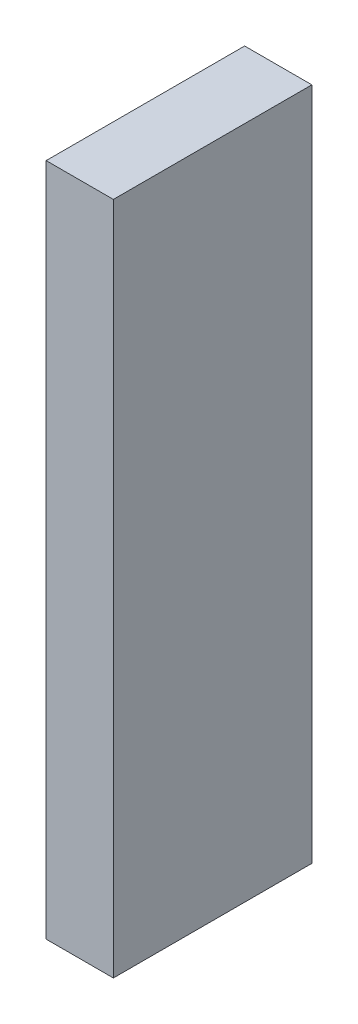
ISO-10303-21;
HEADER;
FILE_DESCRIPTION(('STEP AP214'),'2;1');
FILE_NAME('part.step','',(''),(''),'','','');
FILE_SCHEMA(('AUTOMOTIVE_DESIGN { 1 0 10303 214 1 1 1 1 }'));
ENDSEC;
DATA;
#1=APPLICATION_CONTEXT('core data for automotive mechanical design processes');
#2=APPLICATION_PROTOCOL_DEFINITION('international standard','automotive_design',2000,#1);
#3=PRODUCT_CONTEXT('',#1,'mechanical');
#4=PRODUCT('Part','Part','',(#3));
#5=PRODUCT_RELATED_PRODUCT_CATEGORY('part','',(#4));
#6=PRODUCT_DEFINITION_FORMATION('','',#4);
#7=PRODUCT_DEFINITION_CONTEXT('part definition',#1,'design');
#8=PRODUCT_DEFINITION('design','',#6,#7);
#9=PRODUCT_DEFINITION_SHAPE('','',#8);
#10=(LENGTH_UNIT() NAMED_UNIT(*) SI_UNIT(.MILLI.,.METRE.));
#11=(NAMED_UNIT(*) PLANE_ANGLE_UNIT() SI_UNIT($,.RADIAN.));
#12=(NAMED_UNIT(*) SI_UNIT($,.STERADIAN.) SOLID_ANGLE_UNIT());
#13=UNCERTAINTY_MEASURE_WITH_UNIT(LENGTH_MEASURE(1.E-05),#10,'distance_accuracy_value','');
#14=(GEOMETRIC_REPRESENTATION_CONTEXT(3) GLOBAL_UNCERTAINTY_ASSIGNED_CONTEXT((#13)) GLOBAL_UNIT_ASSIGNED_CONTEXT((#10,
#11,#12)) REPRESENTATION_CONTEXT('',''));
#15=CARTESIAN_POINT('',(0.,0.,0.));
#16=DIRECTION('',(0.,0.,1.));
#17=DIRECTION('',(1.,0.,0.));
#18=AXIS2_PLACEMENT_3D('',#15,#16,#17);
#19=CARTESIAN_POINT('',(-1.01597968,-10.1917754,0.));
#20=DIRECTION('',(-1.,0.,0.));
#21=DIRECTION('',(0.,0.,1.));
#22=AXIS2_PLACEMENT_3D('',#19,#20,#21);
#23=PLANE('',#22);
#24=DIRECTION('',(0.,0.,1.));
#25=VECTOR('',#24,1.);
#26=CARTESIAN_POINT('',(-1.01597968,10.19177794,0.));
#27=LINE('',#26,#25);
#28=CARTESIAN_POINT('',(-1.01597968,10.19177794,0.));
#29=VERTEX_POINT('',#28);
#30=CARTESIAN_POINT('',(-1.01597968,10.19177794,6.0000007));
#31=VERTEX_POINT('',#30);
#32=EDGE_CURVE('E20',#29,#31,#27,.T.);
#33=ORIENTED_EDGE('',*,*,#32,.F.);
#34=DIRECTION('',(0.,1.,0.));
#35=VECTOR('',#34,1.);
#36=CARTESIAN_POINT('',(-1.01597968,10.19177794,0.));
#37=LINE('',#36,#35);
#38=CARTESIAN_POINT('',(-1.01597968,-10.1917754,0.));
#39=VERTEX_POINT('',#38);
#40=EDGE_CURVE('E79',#29,#39,#37,.F.);
#41=ORIENTED_EDGE('',*,*,#40,.T.);
#42=DIRECTION('',(0.,0.,-1.));
#43=VECTOR('',#42,1.);
#44=CARTESIAN_POINT('',(-1.01597968,-10.1917754,0.));
#45=LINE('',#44,#43);
#46=CARTESIAN_POINT('',(-1.01597968,-10.1917754,6.0000007));
#47=VERTEX_POINT('',#46);
#48=EDGE_CURVE('E61',#47,#39,#45,.T.);
#49=ORIENTED_EDGE('',*,*,#48,.F.);
#50=DIRECTION('',(0.,1.,0.));
#51=VECTOR('',#50,1.);
#52=CARTESIAN_POINT('',(-1.01597968,10.19177794,6.0000007));
#53=LINE('',#52,#51);
#54=EDGE_CURVE('E56',#31,#47,#53,.F.);
#55=ORIENTED_EDGE('',*,*,#54,.F.);
#56=EDGE_LOOP('',(#33,#41,#49,#55));
#57=FACE_BOUND('',#56,.T.);
#58=ADVANCED_FACE('F17',(#57),#23,.T.);
#59=CARTESIAN_POINT('',(-1.01597968,10.19177794,0.));
#60=DIRECTION('',(0.,1.,0.));
#61=DIRECTION('',(0.,0.,1.));
#62=AXIS2_PLACEMENT_3D('',#59,#60,#61);
#63=PLANE('',#62);
#64=DIRECTION('',(0.,0.,-1.));
#65=VECTOR('',#64,1.);
#66=CARTESIAN_POINT('',(1.01597968,10.19177794,0.));
#67=LINE('',#66,#65);
#68=CARTESIAN_POINT('',(1.01597968,10.19177794,0.));
#69=VERTEX_POINT('',#68);
#70=CARTESIAN_POINT('',(1.01597968,10.19177794,6.0000007));
#71=VERTEX_POINT('',#70);
#72=EDGE_CURVE('E83',#69,#71,#67,.F.);
#73=ORIENTED_EDGE('',*,*,#72,.F.);
#74=DIRECTION('',(1.,0.,0.));
#75=VECTOR('',#74,1.);
#76=CARTESIAN_POINT('',(-1.01597968,10.19177794,0.));
#77=LINE('',#76,#75);
#78=EDGE_CURVE('E68',#69,#29,#77,.F.);
#79=ORIENTED_EDGE('',*,*,#78,.T.);
#80=ORIENTED_EDGE('',*,*,#32,.T.);
#81=DIRECTION('',(1.,0.,0.));
#82=VECTOR('',#81,1.);
#83=CARTESIAN_POINT('',(-1.01597968,10.19177794,6.0000007));
#84=LINE('',#83,#82);
#85=EDGE_CURVE('E63',#71,#31,#84,.F.);
#86=ORIENTED_EDGE('',*,*,#85,.F.);
#87=EDGE_LOOP('',(#73,#79,#80,#86));
#88=FACE_BOUND('',#87,.T.);
#89=ADVANCED_FACE('F65',(#88),#63,.T.);
#90=CARTESIAN_POINT('',(-1.01597968,10.19177794,6.0000007));
#91=DIRECTION('',(0.,0.,1.));
#92=DIRECTION('',(1.,0.,0.));
#93=AXIS2_PLACEMENT_3D('',#90,#91,#92);
#94=PLANE('',#93);
#95=DIRECTION('',(0.,1.,0.));
#96=VECTOR('',#95,1.);
#97=CARTESIAN_POINT('',(1.01597968,10.19177794,6.0000007));
#98=LINE('',#97,#96);
#99=CARTESIAN_POINT('',(1.01597968,-10.1917754,6.0000007));
#100=VERTEX_POINT('',#99);
#101=EDGE_CURVE('E72',#71,#100,#98,.F.);
#102=ORIENTED_EDGE('',*,*,#101,.F.);
#103=ORIENTED_EDGE('',*,*,#85,.T.);
#104=ORIENTED_EDGE('',*,*,#54,.T.);
#105=DIRECTION('',(1.,0.,0.));
#106=VECTOR('',#105,1.);
#107=CARTESIAN_POINT('',(1.01597968,-10.1917754,6.0000007));
#108=LINE('',#107,#106);
#109=EDGE_CURVE('E74',#100,#47,#108,.F.);
#110=ORIENTED_EDGE('',*,*,#109,.F.);
#111=EDGE_LOOP('',(#102,#103,#104,#110));
#112=FACE_BOUND('',#111,.T.);
#113=ADVANCED_FACE('F70',(#112),#94,.T.);
#114=CARTESIAN_POINT('',(1.01597968,-10.1917754,0.));
#115=DIRECTION('',(0.,-1.,0.));
#116=DIRECTION('',(0.,0.,-1.));
#117=AXIS2_PLACEMENT_3D('',#114,#115,#116);
#118=PLANE('',#117);
#119=ORIENTED_EDGE('',*,*,#48,.T.);
#120=DIRECTION('',(1.,0.,0.));
#121=VECTOR('',#120,1.);
#122=CARTESIAN_POINT('',(-1.01597968,-10.1917754,0.));
#123=LINE('',#122,#121);
#124=CARTESIAN_POINT('',(1.01597968,-10.1917754,0.));
#125=VERTEX_POINT('',#124);
#126=EDGE_CURVE('E35',#39,#125,#123,.T.);
#127=ORIENTED_EDGE('',*,*,#126,.T.);
#128=DIRECTION('',(0.,0.,-1.));
#129=VECTOR('',#128,1.);
#130=CARTESIAN_POINT('',(1.01597968,-10.1917754,0.));
#131=LINE('',#130,#129);
#132=EDGE_CURVE('E26',#100,#125,#131,.T.);
#133=ORIENTED_EDGE('',*,*,#132,.F.);
#134=ORIENTED_EDGE('',*,*,#109,.T.);
#135=EDGE_LOOP('',(#119,#127,#133,#134));
#136=FACE_BOUND('',#135,.T.);
#137=ADVANCED_FACE('F89',(#136),#118,.T.);
#138=CARTESIAN_POINT('',(-1.01597968,10.19177794,0.));
#139=DIRECTION('',(0.,0.,1.));
#140=DIRECTION('',(1.,0.,0.));
#141=AXIS2_PLACEMENT_3D('',#138,#139,#140);
#142=PLANE('',#141);
#143=DIRECTION('',(0.,1.,0.));
#144=VECTOR('',#143,1.);
#145=CARTESIAN_POINT('',(1.01597968,10.19177794,0.));
#146=LINE('',#145,#144);
#147=EDGE_CURVE('E11',#125,#69,#146,.T.);
#148=ORIENTED_EDGE('',*,*,#147,.F.);
#149=ORIENTED_EDGE('',*,*,#126,.F.);
#150=ORIENTED_EDGE('',*,*,#40,.F.);
#151=ORIENTED_EDGE('',*,*,#78,.F.);
#152=EDGE_LOOP('',(#148,#149,#150,#151));
#153=FACE_BOUND('',#152,.T.);
#154=ADVANCED_FACE('F91',(#153),#142,.F.);
#155=CARTESIAN_POINT('',(1.01597968,10.19177794,0.));
#156=DIRECTION('',(1.,0.,0.));
#157=DIRECTION('',(0.,0.,-1.));
#158=AXIS2_PLACEMENT_3D('',#155,#156,#157);
#159=PLANE('',#158);
#160=ORIENTED_EDGE('',*,*,#132,.T.);
#161=ORIENTED_EDGE('',*,*,#147,.T.);
#162=ORIENTED_EDGE('',*,*,#72,.T.);
#163=ORIENTED_EDGE('',*,*,#101,.T.);
#164=EDGE_LOOP('',(#160,#161,#162,#163));
#165=FACE_BOUND('',#164,.T.);
#166=ADVANCED_FACE('F88',(#165),#159,.T.);
#167=CLOSED_SHELL('',(#58,#89,#113,#137,#154,#166));
#168=MANIFOLD_SOLID_BREP('B1',#167);
#169=ADVANCED_BREP_SHAPE_REPRESENTATION('',(#18,#168),#14);
#170=SHAPE_DEFINITION_REPRESENTATION(#9,#169);
ENDSEC;
END-ISO-10303-21;
